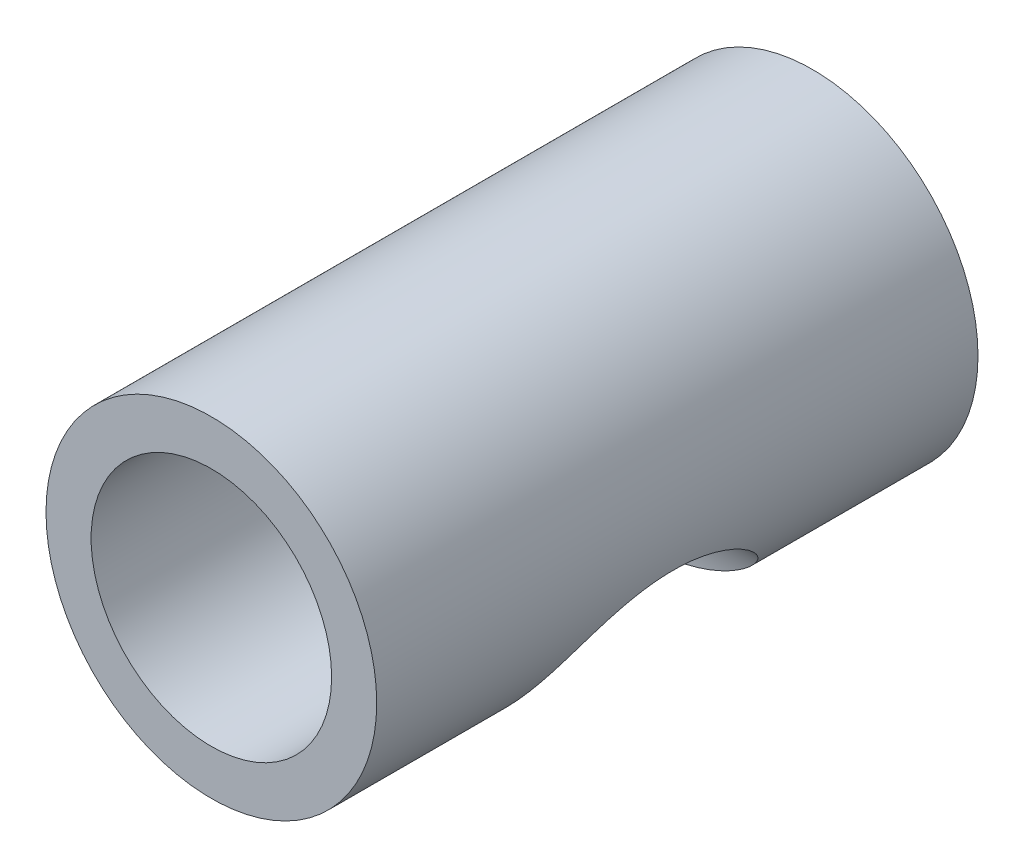
ISO-10303-21;
HEADER;
FILE_DESCRIPTION(('STEP AP214'),'2;1');
FILE_NAME('part.step','',(''),(''),'','','');
FILE_SCHEMA(('AUTOMOTIVE_DESIGN { 1 0 10303 214 1 1 1 1 }'));
ENDSEC;
DATA;
#1=APPLICATION_CONTEXT('core data for automotive mechanical design processes');
#2=APPLICATION_PROTOCOL_DEFINITION('international standard','automotive_design',2000,#1);
#3=PRODUCT_CONTEXT('',#1,'mechanical');
#4=PRODUCT('Part','Part','',(#3));
#5=PRODUCT_RELATED_PRODUCT_CATEGORY('part','',(#4));
#6=PRODUCT_DEFINITION_FORMATION('','',#4);
#7=PRODUCT_DEFINITION_CONTEXT('part definition',#1,'design');
#8=PRODUCT_DEFINITION('design','',#6,#7);
#9=PRODUCT_DEFINITION_SHAPE('','',#8);
#10=(LENGTH_UNIT() NAMED_UNIT(*) SI_UNIT(.MILLI.,.METRE.));
#11=(NAMED_UNIT(*) PLANE_ANGLE_UNIT() SI_UNIT($,.RADIAN.));
#12=(NAMED_UNIT(*) SI_UNIT($,.STERADIAN.) SOLID_ANGLE_UNIT());
#13=UNCERTAINTY_MEASURE_WITH_UNIT(LENGTH_MEASURE(1.E-05),#10,'distance_accuracy_value','');
#14=(GEOMETRIC_REPRESENTATION_CONTEXT(3) GLOBAL_UNCERTAINTY_ASSIGNED_CONTEXT((#13)) GLOBAL_UNIT_ASSIGNED_CONTEXT((#10,
#11,#12)) REPRESENTATION_CONTEXT('',''));
#15=CARTESIAN_POINT('',(0.,0.,0.));
#16=DIRECTION('',(0.,0.,1.));
#17=DIRECTION('',(1.,0.,0.));
#18=AXIS2_PLACEMENT_3D('',#15,#16,#17);
#19=CARTESIAN_POINT('',(0.,0.,-40.));
#20=DIRECTION('',(0.,0.,1.));
#21=DIRECTION('',(1.,0.,0.));
#22=AXIS2_PLACEMENT_3D('',#19,#20,#21);
#23=CYLINDRICAL_SURFACE('',#22,22.);
#24=CARTESIAN_POINT('',(0.,-22.,-17.9722007556114));
#25=CARTESIAN_POINT('',(0.609955336129801,-21.9999959282039,-17.9722080575245));
#26=CARTESIAN_POINT('',(1.22003626195506,-21.9746113319109,-17.9708440628016));
#27=CARTESIAN_POINT('',(2.43607714416588,-21.8732259564118,-17.9647677399582));
#28=CARTESIAN_POINT('',(3.04203582922194,-21.7972102188333,-17.9600544222921));
#29=CARTESIAN_POINT('',(4.24655181825611,-21.5949145393605,-17.9453628122306));
#30=CARTESIAN_POINT('',(4.84509438034091,-21.4685472160377,-17.9353753571082));
#31=CARTESIAN_POINT('',(6.0293584937757,-21.1664885490568,-17.907015965231));
#32=CARTESIAN_POINT('',(6.61508107242791,-20.9908011732707,-17.8886447028916));
#33=CARTESIAN_POINT('',(7.77105596415011,-20.5909143267139,-17.8391982534825));
#34=CARTESIAN_POINT('',(8.34126013954119,-20.3665798195735,-17.8080874857045));
#35=CARTESIAN_POINT('',(9.46003109063052,-19.8716362259652,-17.7278358265739));
#36=CARTESIAN_POINT('',(10.0085957219693,-19.6010225675942,-17.6786931533048));
#37=CARTESIAN_POINT('',(11.0784332175156,-19.0168128392235,-17.5562844432369));
#38=CARTESIAN_POINT('',(11.5997485168614,-18.7032865303422,-17.4830572937982));
#39=CARTESIAN_POINT('',(12.6109774932668,-18.0368923793146,-17.3056723965195));
#40=CARTESIAN_POINT('',(13.1009019694077,-17.6840381824503,-17.2015253559695));
#41=CARTESIAN_POINT('',(13.9282071127263,-17.0355360560999,-16.9856245811256));
#42=CARTESIAN_POINT('',(14.2734640922341,-16.7471702811829,-16.8820454504192));
#43=CARTESIAN_POINT('',(14.9411590455238,-16.1542855371132,-16.6504483479208));
#44=CARTESIAN_POINT('',(15.2636005873643,-15.8497691068178,-16.5224342090987));
#45=CARTESIAN_POINT('',(15.8834686268366,-15.2285204127579,-16.2394728854114));
#46=CARTESIAN_POINT('',(16.1809142545,-14.911797766582,-16.0845465808682));
#47=CARTESIAN_POINT('',(16.7494149567952,-14.2702758067395,-15.7455861667878));
#48=CARTESIAN_POINT('',(17.0204695237202,-13.9454763378431,-15.5615514974475));
#49=CARTESIAN_POINT('',(17.5361932203897,-13.2912096543011,-15.1620233304702));
#50=CARTESIAN_POINT('',(17.7807333508621,-12.9617277322753,-14.9463870695897));
#51=CARTESIAN_POINT('',(18.2414100978174,-12.3049535175245,-14.483690973434));
#52=CARTESIAN_POINT('',(18.4575466256891,-11.9776612316336,-14.2366310401307));
#53=CARTESIAN_POINT('',(18.8616232900406,-11.3306968575457,-13.7113454052296));
#54=CARTESIAN_POINT('',(19.0495602768088,-11.0110256239215,-13.4331162282758));
#55=CARTESIAN_POINT('',(19.3981467114198,-10.3846241064263,-12.8466468569749));
#56=CARTESIAN_POINT('',(19.5587972609645,-10.0778933004558,-12.5384078750778));
#57=CARTESIAN_POINT('',(19.8432928445358,-9.50464768410305,-11.9180624315123));
#58=CARTESIAN_POINT('',(19.9689982462587,-9.23684371313795,-11.6079941981621));
#59=CARTESIAN_POINT('',(20.2001318940581,-8.71979806019983,-10.9656643305917));
#60=CARTESIAN_POINT('',(20.3055613009792,-8.47055531605743,-10.6334039683871));
#61=CARTESIAN_POINT('',(20.4980704216434,-7.99345507806047,-9.94875621981602));
#62=CARTESIAN_POINT('',(20.5851470156879,-7.7656012236365,-9.59636542450149));
#63=CARTESIAN_POINT('',(20.7429457272325,-7.33369512557773,-8.87378654804236));
#64=CARTESIAN_POINT('',(20.8136670432232,-7.1296440486685,-8.50359759575174));
#65=CARTESIAN_POINT('',(20.9435455505268,-6.73885542524165,-7.7311497409779));
#66=CARTESIAN_POINT('',(21.0020565167813,-6.55327568284667,-7.32819646064899));
#67=CARTESIAN_POINT('',(21.1055498854396,-6.21189110343821,-6.50819979190588));
#68=CARTESIAN_POINT('',(21.150532026613,-6.05608684138555,-6.09115613159114));
#69=CARTESIAN_POINT('',(21.2288590530953,-5.77553230903539,-5.24558723367132));
#70=CARTESIAN_POINT('',(21.2622012555323,-5.65078919987349,-4.81705937356551));
#71=CARTESIAN_POINT('',(21.3187974105929,-5.43336853067448,-3.95129044933738));
#72=CARTESIAN_POINT('',(21.342050981481,-5.34069218401219,-3.51404905616543));
#73=CARTESIAN_POINT('',(21.3810198924685,-5.18257980820202,-2.60173421267265));
#74=CARTESIAN_POINT('',(21.3960705824882,-5.11959055252577,-2.12620663802647));
#75=CARTESIAN_POINT('',(21.4168954563876,-5.03176103023032,-1.17142988822584));
#76=CARTESIAN_POINT('',(21.4226692102147,-5.00692253217514,-0.692180541575295));
#77=CARTESIAN_POINT('',(21.4253150564338,-4.99558936670512,0.266915425038783));
#78=CARTESIAN_POINT('',(21.4221849804319,-5.00910403962729,0.746762162042908));
#79=CARTESIAN_POINT('',(21.4068133884969,-5.07439231405331,1.70370020738862));
#80=CARTESIAN_POINT('',(21.3945718232356,-5.12616612268673,2.18079150079854));
#81=CARTESIAN_POINT('',(21.3597476825997,-5.26941793087152,3.14139991599998));
#82=CARTESIAN_POINT('',(21.3369027960953,-5.36189980069685,3.62475832141983));
#83=CARTESIAN_POINT('',(21.2793517491399,-5.58592411722927,4.58163869013182));
#84=CARTESIAN_POINT('',(21.2446452669753,-5.71746762336501,5.05516038626024));
#85=CARTESIAN_POINT('',(21.1613621467633,-6.01839771596442,5.98880067922696));
#86=CARTESIAN_POINT('',(21.1127851302238,-6.18778533507174,6.44891890994063));
#87=CARTESIAN_POINT('',(20.9992745658811,-6.56268242742935,7.35211750004768));
#88=CARTESIAN_POINT('',(20.9343415315566,-6.76819076664948,7.79519839380565));
#89=CARTESIAN_POINT('',(20.7867680541933,-7.2085412818245,8.65200214963934));
#90=CARTESIAN_POINT('',(20.7045096522397,-7.44271102641215,9.06613603570466));
#91=CARTESIAN_POINT('',(20.5186826699147,-7.940670096908,9.87119874406365));
#92=CARTESIAN_POINT('',(20.415114315878,-8.2044591082141,10.2621278127607));
#93=CARTESIAN_POINT('',(20.1839043052163,-8.75784283271679,11.0172540294381));
#94=CARTESIAN_POINT('',(20.0562816242776,-9.04741711038917,11.3814719365104));
#95=CARTESIAN_POINT('',(19.774307334063,-9.64814876234667,12.0805799132588));
#96=CARTESIAN_POINT('',(19.619957986526,-9.95930430898663,12.4154724609796));
#97=CARTESIAN_POINT('',(19.2946654912596,-10.5748810421181,13.0304180510124));
#98=CARTESIAN_POINT('',(19.1257356604049,-10.8781559750019,13.3126865119064));
#99=CARTESIAN_POINT('',(18.7619335441578,-11.4942494000852,13.8486236966863));
#100=CARTESIAN_POINT('',(18.567062731025,-11.8070673499023,14.1022940421274));
#101=CARTESIAN_POINT('',(18.1509011515997,-12.4373367122326,14.5803495839554));
#102=CARTESIAN_POINT('',(17.9296153004261,-12.7547872531277,14.8047402122858));
#103=CARTESIAN_POINT('',(17.4607388470115,-13.3894823547935,15.2244118006337));
#104=CARTESIAN_POINT('',(17.2131483197426,-13.7067269161487,15.419692843614));
#105=CARTESIAN_POINT('',(16.7033472508835,-14.3231075128395,15.774431219362));
#106=CARTESIAN_POINT('',(16.442183143534,-14.6224455333049,15.9350462786833));
#107=CARTESIAN_POINT('',(15.8975362001863,-15.2128113412458,16.2317235264531));
#108=CARTESIAN_POINT('',(15.6140541400891,-15.503839417144,16.3677865679307));
#109=CARTESIAN_POINT('',(15.0261026558583,-16.0743301235777,16.617222242592));
#110=CARTESIAN_POINT('',(14.7216270150908,-16.3537892887726,16.7305881155428));
#111=CARTESIAN_POINT('',(14.0933763925753,-16.8982118332868,16.9367332007778));
#112=CARTESIAN_POINT('',(13.7696002262776,-17.1631743209698,17.0295111478458));
#113=CARTESIAN_POINT('',(13.0730150021984,-17.7004970145284,17.2047237514287));
#114=CARTESIAN_POINT('',(12.6984643037641,-17.9711881407467,17.2853511417694));
#115=CARTESIAN_POINT('',(11.9305922826194,-18.4898811204661,17.4278855320789));
#116=CARTESIAN_POINT('',(11.5372700406044,-18.7378818610054,17.4897916141119));
#117=CARTESIAN_POINT('',(10.7339076701721,-19.2093794819341,17.598003987053));
#118=CARTESIAN_POINT('',(10.3238596079808,-19.4328645436189,17.6443027759803));
#119=CARTESIAN_POINT('',(9.48938283393815,-19.8537161671667,17.7241860445349));
#120=CARTESIAN_POINT('',(9.06495322604144,-20.0510810978367,17.7577697303521));
#121=CARTESIAN_POINT('',(8.12901944525285,-20.4504483444325,17.8198620978762));
#122=CARTESIAN_POINT('',(7.61518880697327,-20.647309150528,17.8464780204154));
#123=CARTESIAN_POINT('',(6.57383034419131,-21.0020814277692,17.8896689133302));
#124=CARTESIAN_POINT('',(6.04630123166642,-21.1599892215271,17.9062429359077));
#125=CARTESIAN_POINT('',(4.98055541747345,-21.4358841990255,17.9324501519492));
#126=CARTESIAN_POINT('',(4.44233530507034,-21.5538584190138,17.9420810926044));
#127=CARTESIAN_POINT('',(3.35850477632841,-21.749107923107,17.9567491034816));
#128=CARTESIAN_POINT('',(2.81289415247145,-21.8263820619545,17.9617860444362));
#129=CARTESIAN_POINT('',(1.66034296633937,-21.9456800568775,17.9692081879324));
#130=CARTESIAN_POINT('',(1.05292896344783,-21.9831985968369,17.9712628785934));
#131=CARTESIAN_POINT('',(-0.162952281102827,-22.0077998177511,17.9726366404779));
#132=CARTESIAN_POINT('',(-0.771419598516798,-21.9948787064378,17.9719555060101));
#133=CARTESIAN_POINT('',(-1.98550568695384,-21.9186654804486,17.9675311656583));
#134=CARTESIAN_POINT('',(-2.59112280491597,-21.8553470709737,17.9637863612755));
#135=CARTESIAN_POINT('',(-3.79497423731832,-21.6787518006826,17.9516606167276));
#136=CARTESIAN_POINT('',(-4.39320866445242,-21.5654757034232,17.9432797474198));
#137=CARTESIAN_POINT('',(-5.58712383561355,-21.2876811007909,17.9189201620001));
#138=CARTESIAN_POINT('',(-6.18262737831102,-21.1224094921258,17.9028278350189));
#139=CARTESIAN_POINT('',(-7.35731049564541,-20.742493259049,17.8588971057447));
#140=CARTESIAN_POINT('',(-7.93648872521252,-20.5278445796482,17.8310577385938));
#141=CARTESIAN_POINT('',(-9.07348249771636,-20.0512248921329,17.7584563388569));
#142=CARTESIAN_POINT('',(-9.63131311777539,-19.7892880586307,17.71370650191));
#143=CARTESIAN_POINT('',(-10.7212010988965,-19.2206486907891,17.6011489536339));
#144=CARTESIAN_POINT('',(-11.2532649001292,-18.9139574201086,17.5333470382874));
#145=CARTESIAN_POINT('',(-12.1789421199561,-18.3277908798878,17.3851010975318));
#146=CARTESIAN_POINT('',(-12.5783066212634,-18.0559565008109,17.3102334891767));
#147=CARTESIAN_POINT('',(-13.3552085463248,-17.4891246087697,17.1382014680578));
#148=CARTESIAN_POINT('',(-13.7327488667066,-17.1941301820499,17.0410400228032));
#149=CARTESIAN_POINT('',(-14.4631402527292,-16.5844404945026,16.8209839190955));
#150=CARTESIAN_POINT('',(-14.8160119817833,-16.2697621507838,16.6981111505707));
#151=CARTESIAN_POINT('',(-15.4949713329612,-15.624505210186,16.4233064934063));
#152=CARTESIAN_POINT('',(-15.8210586530568,-15.2939264340761,16.2713742771488));
#153=CARTESIAN_POINT('',(-16.4464913591613,-14.6193687103787,15.9344937142741));
#154=CARTESIAN_POINT('',(-16.7456312357255,-14.2753115073112,15.7493193956491));
#155=CARTESIAN_POINT('',(-17.3128815600375,-13.5817828521157,15.3446506781699));
#156=CARTESIAN_POINT('',(-17.5809919949813,-13.2323113977536,15.1251562651541));
#157=CARTESIAN_POINT('',(-18.0851955864276,-12.5343931528776,14.6509038385388));
#158=CARTESIAN_POINT('',(-18.3212989325634,-12.1859460709727,14.3961571001491));
#159=CARTESIAN_POINT('',(-18.7615929844714,-11.4965184782642,13.8514553909576));
#160=CARTESIAN_POINT('',(-18.9657867413567,-11.1555372562782,13.5615037910713));
#161=CARTESIAN_POINT('',(-19.3212641680024,-10.5263376350481,12.9833931990099));
#162=CARTESIAN_POINT('',(-19.4759403419711,-10.2365994887254,12.6989587886746));
#163=CARTESIAN_POINT('',(-19.7624241761547,-9.67196022687255,12.1050075048996));
#164=CARTESIAN_POINT('',(-19.8942338180852,-9.39705782703436,11.7954928084435));
#165=CARTESIAN_POINT('',(-20.1366793406602,-8.86563616089515,11.1531859162055));
#166=CARTESIAN_POINT('',(-20.2473113729309,-8.60912024105451,10.8203895046686));
#167=CARTESIAN_POINT('',(-20.449330517917,-8.11760504590501,10.1337362842141));
#168=CARTESIAN_POINT('',(-20.5407168545145,-7.88260663854525,9.77987862670108));
#169=CARTESIAN_POINT('',(-20.7070031053443,-7.4348867048159,9.0505169496052));
#170=CARTESIAN_POINT('',(-20.7817624605859,-7.22236252508733,8.67485990629495));
#171=CARTESIAN_POINT('',(-20.9159781220775,-6.82393343884376,7.90708202989412));
#172=CARTESIAN_POINT('',(-20.9754345201487,-6.63802837261133,7.51496129560564));
#173=CARTESIAN_POINT('',(-21.0810785920763,-6.29447737256152,6.71672250207068));
#174=CARTESIAN_POINT('',(-21.1272637028386,-6.13683689971489,6.31060175593026));
#175=CARTESIAN_POINT('',(-21.2081621397067,-5.85114536301618,5.48696788542021));
#176=CARTESIAN_POINT('',(-21.242874924246,-5.72309569612368,5.06945422423959));
#177=CARTESIAN_POINT('',(-21.304646074299,-5.48888645527776,4.19310146813683));
#178=CARTESIAN_POINT('',(-21.3309108797715,-5.38516636863692,3.73355285697391));
#179=CARTESIAN_POINT('',(-21.3733887419386,-5.21402198815889,2.80728309917185));
#180=CARTESIAN_POINT('',(-21.3896013411431,-5.146599346288,2.34056162707618));
#181=CARTESIAN_POINT('',(-21.4129527367268,-5.04856442950113,1.4029264479796));
#182=CARTESIAN_POINT('',(-21.4200892836453,-5.01796128024076,0.93201173081188));
#183=CARTESIAN_POINT('',(-21.4257284951677,-4.99382671515735,-0.0108186390966603));
#184=CARTESIAN_POINT('',(-21.424231037396,-5.00029582478393,-0.482734305929829));
#185=CARTESIAN_POINT('',(-21.4122703991247,-5.05127856801201,-1.44367761751954));
#186=CARTESIAN_POINT('',(-21.4014447998931,-5.09732987371577,-1.93262000982575));
#187=CARTESIAN_POINT('',(-21.3696156643365,-5.22915969278198,-2.90480217056602));
#188=CARTESIAN_POINT('',(-21.3486117768064,-5.31493957698758,-3.38804174163294));
#189=CARTESIAN_POINT('',(-21.2950823297299,-5.52551027316797,-4.34539431791827));
#190=CARTESIAN_POINT('',(-21.2625547905062,-5.65030778764733,-4.81950574022437));
#191=CARTESIAN_POINT('',(-21.1840758099042,-5.93777016673801,-5.75497396930827));
#192=CARTESIAN_POINT('',(-21.1381245985726,-6.10043438240313,-6.21633099451489));
#193=CARTESIAN_POINT('',(-21.0307223229794,-6.46094893478917,-7.12004493201384));
#194=CARTESIAN_POINT('',(-20.9693644187666,-6.65858575348613,-7.56249797920894));
#195=CARTESIAN_POINT('',(-20.8282899385643,-7.0875442558355,-8.42774500282049));
#196=CARTESIAN_POINT('',(-20.74857329096,-7.31886607088695,-8.85053890254167));
#197=CARTESIAN_POINT('',(-20.5678888588997,-7.81222627212587,-9.67270433869844));
#198=CARTESIAN_POINT('',(-20.4669340584733,-8.0742458479467,-10.0720899959831));
#199=CARTESIAN_POINT('',(-20.240777328679,-8.62552162569339,-10.8443239870833));
#200=CARTESIAN_POINT('',(-20.1155772621138,-8.91477573426981,-11.2171743566398));
#201=CARTESIAN_POINT('',(-19.8464471712965,-9.49818158815046,-11.9119381670467));
#202=CARTESIAN_POINT('',(-19.7040765473281,-9.79101587113957,-12.2355627081174));
#203=CARTESIAN_POINT('',(-19.3935527929566,-10.3925264343281,-12.8544853610104));
#204=CARTESIAN_POINT('',(-19.2254009027734,-10.7012019520025,-13.149784834313));
#205=CARTESIAN_POINT('',(-18.8620412865074,-11.3293846844285,-13.7103570682231));
#206=CARTESIAN_POINT('',(-18.666846371258,-11.6488867166178,-13.9756439389492));
#207=CARTESIAN_POINT('',(-18.2486641158129,-12.293650440332,-14.4755130312534));
#208=CARTESIAN_POINT('',(-18.0256777776373,-12.6189119238371,-14.7100963592234));
#209=CARTESIAN_POINT('',(-17.5675371124705,-13.2485144475013,-15.1341682902573));
#210=CARTESIAN_POINT('',(-17.334141911255,-13.5528274605831,-15.3256060650333));
#211=CARTESIAN_POINT('',(-16.8437496807457,-14.1576710251922,-15.6823628199033));
#212=CARTESIAN_POINT('',(-16.5867538439595,-14.4582017669611,-15.8476831185305));
#213=CARTESIAN_POINT('',(-16.0501419477171,-15.0516784952989,-16.1535035946759));
#214=CARTESIAN_POINT('',(-15.7705214392154,-15.3446229750378,-16.2939988730812));
#215=CARTESIAN_POINT('',(-15.1900722915367,-15.9194400341549,-16.551886120559));
#216=CARTESIAN_POINT('',(-14.8892425680468,-16.2013120463086,-16.6692769072584));
#217=CARTESIAN_POINT('',(-14.2517486571284,-16.7653847574694,-16.8886319560421));
#218=CARTESIAN_POINT('',(-13.9140335543238,-17.0468341023303,-16.9894706491745));
#219=CARTESIAN_POINT('',(-13.2188920979495,-17.5913579052044,-17.1705837880585));
#220=CARTESIAN_POINT('',(-12.861465186227,-17.8544318424272,-17.2508576511398));
#221=CARTESIAN_POINT('',(-12.1286910428689,-18.3600968959772,-17.3936881279823));
#222=CARTESIAN_POINT('',(-11.7533321295101,-18.6026743671007,-17.4562330031696));
#223=CARTESIAN_POINT('',(-10.9869146495273,-19.0653648230951,-17.566308724486));
#224=CARTESIAN_POINT('',(-10.5958552759009,-19.2854766511687,-17.6138387977391));
#225=CARTESIAN_POINT('',(-9.73392526474554,-19.7363833527559,-17.7033923863781));
#226=CARTESIAN_POINT('',(-9.26057700184831,-19.962892434409,-17.7431941981762));
#227=CARTESIAN_POINT('',(-8.29809438278016,-20.3817857676804,-17.809827267962));
#228=CARTESIAN_POINT('',(-7.80895772873389,-20.5741650252629,-17.8366566287491));
#229=CARTESIAN_POINT('',(-6.81807418083182,-20.9234245140722,-17.8806822985942));
#230=CARTESIAN_POINT('',(-6.31633437928659,-21.0803242349572,-17.8978839040798));
#231=CARTESIAN_POINT('',(-5.30280764204462,-21.3578135506762,-17.925476317346));
#232=CARTESIAN_POINT('',(-4.79102260130872,-21.4784099250634,-17.9358683972145));
#233=CARTESIAN_POINT('',(-3.92389017418285,-21.6502126684017,-17.9494534681948));
#234=CARTESIAN_POINT('',(-3.57048333935236,-21.7112927108781,-17.9538846486696));
#235=CARTESIAN_POINT('',(-2.86104933473744,-21.8161169003032,-17.9611024287666));
#236=CARTESIAN_POINT('',(-2.50502196171638,-21.8598596879138,-17.9638888994426));
#237=CARTESIAN_POINT('',(-1.7912450099034,-21.9298889995194,-17.96819688938));
#238=CARTESIAN_POINT('',(-1.43349542977819,-21.9561755099977,-17.969718407662));
#239=CARTESIAN_POINT('',(-0.717178339268484,-21.9912317210906,-17.9717181653195));
#240=CARTESIAN_POINT('',(-0.358610875387091,-22.00000239393,-17.9721964625997));
#241=CARTESIAN_POINT('',(0.,-22.,-17.9722007556114));
#242=B_SPLINE_CURVE_WITH_KNOTS('',3,(#24,#25,#26,#27,#28,#29,#30,#31,#32,#33,#34,#35,#36,#37,
#38,#39,#40,#41,#42,#43,#44,#45,#46,#47,#48,#49,#50,#51,#52,#53,#54,#55,#56,#57,#58,#59,#60,#61,
#62,#63,#64,#65,#66,#67,#68,#69,#70,#71,#72,#73,#74,#75,#76,#77,#78,#79,#80,#81,#82,#83,#84,#85,
#86,#87,#88,#89,#90,#91,#92,#93,#94,#95,#96,#97,#98,#99,#100,#101,#102,#103,#104,#105,#106,#107,
#108,#109,#110,#111,#112,#113,#114,#115,#116,#117,#118,#119,#120,#121,#122,#123,#124,#125,#126,
#127,#128,#129,#130,#131,#132,#133,#134,#135,#136,#137,#138,#139,#140,#141,#142,#143,#144,#145,
#146,#147,#148,#149,#150,#151,#152,#153,#154,#155,#156,#157,#158,#159,#160,#161,#162,#163,#164,
#165,#166,#167,#168,#169,#170,#171,#172,#173,#174,#175,#176,#177,#178,#179,#180,#181,#182,#183,
#184,#185,#186,#187,#188,#189,#190,#191,#192,#193,#194,#195,#196,#197,#198,#199,#200,#201,#202,
#203,#204,#205,#206,#207,#208,#209,#210,#211,#212,#213,#214,#215,#216,#217,#218,#219,#220,#221,
#222,#223,#224,#225,#226,#227,#228,#229,#230,#231,#232,#233,#234,#235,#236,#237,#238,#239,#240,
#241),.UNSPECIFIED.,.T.,.F.,(4,2,2,2,2,2,2,2,2,2,2,2,2,2,2,2,2,2,2,2,2,2,2,2,2,2,2,2,2,2,2,2,2,
2,2,2,2,2,2,2,2,2,2,2,2,2,2,2,2,2,2,2,2,2,2,2,2,2,2,2,2,2,2,2,2,2,2,2,2,2,2,2,2,2,2,2,2,2,2,2,2,
2,2,2,2,2,2,2,2,2,2,2,2,2,2,2,2,2,2,2,2,2,2,2,2,2,2,2,4),(0.,1.82955442278934,3.65964960571486,
5.49293471262732,7.32607237126076,9.16436518247888,11.0028397030961,12.8383602338216,
14.6732458796494,16.0567248804553,17.4399870414776,18.8221807267675,20.2044009972189,
21.593069920728,22.9817431763884,24.3705714228579,25.7593435814397,27.043561514933,
28.327705902274,29.6120683988725,30.8964938238189,32.2374691370058,33.5784703416435,
34.9197804278765,36.2611412624183,37.699246484283,39.1374183707322,40.5759405323326,
42.014470481946,43.4906572543379,44.9668840674845,46.4431511670145,47.9193719265914,
49.3659287448476,50.8124701999024,52.2578752650748,53.7031580728552,55.0436961652896,
56.3841582089726,57.7243712168534,59.0645804050369,60.3486657830503,61.6327065385425,
62.9171291717666,64.2016307164093,65.6075773132199,67.0135928346816,68.4202832272446,
69.8270614257093,71.4780250691212,73.129144513374,74.7807994524301,76.4325008648355,
78.2560915166682,80.0798192764632,81.9044991907725,83.729151217518,85.5815528429957,
87.4341066474408,89.2853269530047,91.1360821501286,92.6012700163031,94.0662629658815,
95.5300136979178,96.9937809333347,98.4679037503848,99.9420271757141,101.415680198064,
102.889192227158,104.191082119334,105.492859127499,106.794872469166,108.09693830686,
109.409625001654,110.722303819862,112.035235986631,113.348230123279,114.76215888094,
116.17615198377,117.590495470507,119.004859003718,120.476786227665,121.948764244562,
123.420995259017,124.893201044751,126.356710597339,127.820225858964,129.28284898138,
130.745359772672,132.120776024195,133.49612613142,134.870826920907,136.245478159866,
137.529908639309,138.814274253915,140.098893050259,141.383577569934,142.735342726929,
144.087146179716,145.43984259809,146.792608634188,148.36979883938,149.947219636438,
151.523771806551,153.100029376845,154.175653370759,155.251361682952,156.327070828077,
157.402720263801),.UNSPECIFIED.);
#243=CARTESIAN_POINT('',(0.,-22.,-17.9722007556114));
#244=VERTEX_POINT('',#243);
#245=EDGE_CURVE('E58',#244,#244,#242,.T.);
#246=ORIENTED_EDGE('',*,*,#245,.F.);
#247=EDGE_LOOP('',(#246));
#248=FACE_BOUND('',#247,.T.);
#249=CARTESIAN_POINT('',(0.,0.,-40.));
#250=DIRECTION('',(0.,0.,1.));
#251=DIRECTION('',(1.,0.,0.));
#252=AXIS2_PLACEMENT_3D('',#249,#250,#251);
#253=CIRCLE('',#252,22.);
#254=CARTESIAN_POINT('',(22.,0.,-40.));
#255=VERTEX_POINT('',#254);
#256=EDGE_CURVE('E10',#255,#255,#253,.T.);
#257=ORIENTED_EDGE('',*,*,#256,.T.);
#258=EDGE_LOOP('',(#257));
#259=FACE_BOUND('',#258,.T.);
#260=CARTESIAN_POINT('',(0.,0.,40.));
#261=DIRECTION('',(0.,0.,1.));
#262=DIRECTION('',(1.,0.,0.));
#263=AXIS2_PLACEMENT_3D('',#260,#261,#262);
#264=CIRCLE('',#263,22.);
#265=CARTESIAN_POINT('',(22.,0.,40.));
#266=VERTEX_POINT('',#265);
#267=EDGE_CURVE('E50',#266,#266,#264,.T.);
#268=ORIENTED_EDGE('',*,*,#267,.F.);
#269=EDGE_LOOP('',(#268));
#270=FACE_BOUND('',#269,.T.);
#271=ADVANCED_FACE('F33',(#248,#259,#270),#23,.T.);
#272=CARTESIAN_POINT('',(0.,0.,-40.));
#273=DIRECTION('',(0.,0.,1.));
#274=DIRECTION('',(1.,0.,0.));
#275=AXIS2_PLACEMENT_3D('',#272,#273,#274);
#276=PLANE('',#275);
#277=CARTESIAN_POINT('',(0.,0.,-40.));
#278=DIRECTION('',(0.,0.,1.));
#279=DIRECTION('',(1.,0.,0.));
#280=AXIS2_PLACEMENT_3D('',#277,#278,#279);
#281=CIRCLE('',#280,16.);
#282=CARTESIAN_POINT('',(16.,0.,-40.));
#283=VERTEX_POINT('',#282);
#284=EDGE_CURVE('E46',#283,#283,#281,.T.);
#285=ORIENTED_EDGE('',*,*,#284,.T.);
#286=EDGE_LOOP('',(#285));
#287=FACE_BOUND('',#286,.T.);
#288=ORIENTED_EDGE('',*,*,#256,.F.);
#289=EDGE_LOOP('',(#288));
#290=FACE_BOUND('',#289,.T.);
#291=ADVANCED_FACE('F75',(#287,#290),#276,.F.);
#292=CARTESIAN_POINT('',(0.,0.,-40.));
#293=DIRECTION('',(0.,0.,1.));
#294=DIRECTION('',(1.,0.,0.));
#295=AXIS2_PLACEMENT_3D('',#292,#293,#294);
#296=CYLINDRICAL_SURFACE('',#295,16.);
#297=CARTESIAN_POINT('',(0.,-16.,-16.583123951777));
#298=CARTESIAN_POINT('',(0.402852087683734,-15.9999994695357,-16.5831243434702));
#299=CARTESIAN_POINT('',(0.805713046698957,-15.9847724622774,-16.5767210143745));
#300=CARTESIAN_POINT('',(1.60873455012412,-15.9240106985183,-16.5508748535843));
#301=CARTESIAN_POINT('',(2.00889500241316,-15.8784749133373,-16.5314315793137));
#302=CARTESIAN_POINT('',(2.80383960119146,-15.7575423084469,-16.4788092374949));
#303=CARTESIAN_POINT('',(3.19862285819317,-15.6821406089528,-16.4456279252518));
#304=CARTESIAN_POINT('',(3.97996234194211,-15.5022772070773,-16.3644090230876));
#305=CARTESIAN_POINT('',(4.36651865571733,-15.3978158122662,-16.3163715904044));
#306=CARTESIAN_POINT('',(5.12944418607889,-15.1607622052794,-16.2038142517075));
#307=CARTESIAN_POINT('',(5.50578827562522,-15.0281066502426,-16.1392571637886));
#308=CARTESIAN_POINT('',(6.24447847558824,-14.7364902943711,-15.9919066438675));
#309=CARTESIAN_POINT('',(6.60682451351397,-14.5775293573327,-15.9091131174402));
#310=CARTESIAN_POINT('',(7.31443580325185,-14.2356362314248,-15.723350001212));
#311=CARTESIAN_POINT('',(7.65970937288672,-14.0527158774678,-15.6203903602401));
#312=CARTESIAN_POINT('',(8.33052013388151,-13.6657357445919,-15.392268167129));
#313=CARTESIAN_POINT('',(8.65605840205211,-13.461677120682,-15.2671068278393));
#314=CARTESIAN_POINT('',(9.27249810653631,-13.0443048340021,-14.998110187173));
#315=CARTESIAN_POINT('',(9.56425541365506,-12.8316629761601,-14.8551940888607));
#316=CARTESIAN_POINT('',(10.1250949581051,-12.3939090082524,-14.5458797120833));
#317=CARTESIAN_POINT('',(10.394177919647,-12.1687972968503,-14.3794821840611));
#318=CARTESIAN_POINT('',(10.9079980502912,-11.7104258679033,-14.0224760627059));
#319=CARTESIAN_POINT('',(11.152745959753,-11.4771698068665,-13.8318782355941));
#320=CARTESIAN_POINT('',(11.6170738749798,-11.006942466241,-13.4262035832993));
#321=CARTESIAN_POINT('',(11.8366548538041,-10.7699713306957,-13.2111277051818));
#322=CARTESIAN_POINT('',(12.2374037050752,-10.311776381008,-12.7711956008929));
#323=CARTESIAN_POINT('',(12.4201175383043,-10.0904977073675,-12.5478004819718));
#324=CARTESIAN_POINT('',(12.7635741907138,-9.65239141520425,-12.0807221772243));
#325=CARTESIAN_POINT('',(12.9243180343244,-9.43556358954563,-11.8370399382114));
#326=CARTESIAN_POINT('',(13.2247263885157,-9.00969259711474,-11.3305256091217));
#327=CARTESIAN_POINT('',(13.3643854405472,-8.80065145671806,-11.0676885861702));
#328=CARTESIAN_POINT('',(13.623832690704,-8.39341967583979,-10.5244039962055));
#329=CARTESIAN_POINT('',(13.7436199429506,-8.19522955215692,-10.2439555917828));
#330=CARTESIAN_POINT('',(13.9694632680878,-7.80430499207865,-9.65509664783993));
#331=CARTESIAN_POINT('',(14.0747388570243,-7.61214231512275,-9.34600783400092));
#332=CARTESIAN_POINT('',(14.2672942118242,-7.2448143561997,-8.71253175892136));
#333=CARTESIAN_POINT('',(14.3545736451225,-7.06964938837838,-8.38814421509953));
#334=CARTESIAN_POINT('',(14.5131211282544,-6.73818166812483,-7.72595702376875));
#335=CARTESIAN_POINT('',(14.5843833153166,-6.58188583199374,-7.38815251833046));
#336=CARTESIAN_POINT('',(14.7127412999132,-6.28972981174363,-6.70121048885248));
#337=CARTESIAN_POINT('',(14.769836246362,-6.1538708555468,-6.35207228537402));
#338=CARTESIAN_POINT('',(14.8782416460693,-5.88738321888548,-5.598073165612));
#339=CARTESIAN_POINT('',(14.9278187269313,-5.75976290988199,-5.19189690174402));
#340=CARTESIAN_POINT('',(15.0132108608752,-5.53336540895186,-4.37016658447038));
#341=CARTESIAN_POINT('',(15.0490249117276,-5.43459031767169,-3.95461185045258));
#342=CARTESIAN_POINT('',(15.1086003398458,-5.26670115852771,-3.11653915898921));
#343=CARTESIAN_POINT('',(15.1323570353836,-5.19759861376241,-2.69401856242773));
#344=CARTESIAN_POINT('',(15.1690033827639,-5.08965353678537,-1.84466418078642));
#345=CARTESIAN_POINT('',(15.1818926501803,-5.0508120750374,-1.41783024366629));
#346=CARTESIAN_POINT('',(15.1982569690711,-5.00137796565699,-0.520393307788512));
#347=CARTESIAN_POINT('',(15.2006871531424,-4.99392218725959,-0.0495952014382476));
#348=CARTESIAN_POINT('',(15.1934436704775,-5.01591354943034,0.89106790076885));
#349=CARTESIAN_POINT('',(15.1837691656826,-5.04536324512072,1.36093282976196));
#350=CARTESIAN_POINT('',(15.1516795821029,-5.1409289789348,2.29670785362722));
#351=CARTESIAN_POINT('',(15.1292587092343,-5.20706169163137,2.76261605207701));
#352=CARTESIAN_POINT('',(15.0702734937474,-5.37538862581941,3.68697110404551));
#353=CARTESIAN_POINT('',(15.0337092583077,-5.47758257403833,4.14541801407842));
#354=CARTESIAN_POINT('',(14.9435753064514,-5.71895325569608,5.05887115069006));
#355=CARTESIAN_POINT('',(14.8897379588924,-5.85870598977042,5.51369930729714));
#356=CARTESIAN_POINT('',(14.7623106823906,-6.17275324741627,6.40847492576559));
#357=CARTESIAN_POINT('',(14.6887200527457,-6.34704899626412,6.84842185912641));
#358=CARTESIAN_POINT('',(14.5183206948361,-6.72768889054809,7.70929481934766));
#359=CARTESIAN_POINT('',(14.4215253313296,-6.93401456434025,8.13023162984272));
#360=CARTESIAN_POINT('',(14.2008253910271,-7.37545919220602,8.94930426659537));
#361=CARTESIAN_POINT('',(14.0769240587847,-7.61057469868753,9.34744281458858));
#362=CARTESIAN_POINT('',(13.808360320944,-8.08692064895453,10.0885890710958));
#363=CARTESIAN_POINT('',(13.665894846282,-8.32642977394426,10.4334979082415));
#364=CARTESIAN_POINT('',(13.3515009476279,-8.82175743497559,11.0972451972582));
#365=CARTESIAN_POINT('',(13.1795740132404,-9.0775751460262,11.4160849660075));
#366=CARTESIAN_POINT('',(12.8042700181987,-9.59967972822222,12.0246402570696));
#367=CARTESIAN_POINT('',(12.6009322477252,-9.86595321462555,12.3143914277937));
#368=CARTESIAN_POINT('',(12.1613715894083,-10.4029468249809,12.8631877823824));
#369=CARTESIAN_POINT('',(11.9251537552135,-10.6736662599638,13.1222376737107));
#370=CARTESIAN_POINT('',(11.4548434219095,-11.1753233172787,13.5747882611737));
#371=CARTESIAN_POINT('',(11.2250094940886,-11.4065656055752,13.772396201518));
#372=CARTESIAN_POINT('',(10.7415158573752,-11.8629802429389,14.1440228753958));
#373=CARTESIAN_POINT('',(10.487858574693,-12.0881532071167,14.3180440066488));
#374=CARTESIAN_POINT('',(9.95789873203571,-12.5283251795242,14.6430506451255));
#375=CARTESIAN_POINT('',(9.68159242502857,-12.7433224949863,14.7940323288546));
#376=CARTESIAN_POINT('',(9.10809052715498,-13.1593378810868,15.0739595699994));
#377=CARTESIAN_POINT('',(8.81089466854636,-13.3603557724846,15.2029048449008));
#378=CARTESIAN_POINT('',(8.2112163864697,-13.736654873006,15.43493271073));
#379=CARTESIAN_POINT('',(7.90954222629786,-13.9126793979907,15.5389037524577));
#380=CARTESIAN_POINT('',(7.2910408924732,-14.2465512883999,15.7294020907126));
#381=CARTESIAN_POINT('',(6.97421435449156,-14.4043994154138,15.8159301182147));
#382=CARTESIAN_POINT('',(6.32745164715952,-14.6999934074431,15.9730374353435));
#383=CARTESIAN_POINT('',(5.99751342508541,-14.8377361089175,16.0436142160355));
#384=CARTESIAN_POINT('',(5.3266936625617,-15.091552787387,16.1702375347925));
#385=CARTESIAN_POINT('',(4.9858115434315,-15.2076256163249,16.2262833030742));
#386=CARTESIAN_POINT('',(4.27278487249813,-15.4237135667683,16.3283526882055));
#387=CARTESIAN_POINT('',(3.90004801921034,-15.5221956528282,16.3734886960226));
#388=CARTESIAN_POINT('',(3.14709475536102,-15.6921885108323,16.4500632803019));
#389=CARTESIAN_POINT('',(2.76687808309,-15.7636983372786,16.4815013765972));
#390=CARTESIAN_POINT('',(2.00133202845029,-15.879060271211,16.5316720506557));
#391=CARTESIAN_POINT('',(1.61600117770454,-15.9229042518841,16.5504008952113));
#392=CARTESIAN_POINT('',(0.842775623267288,-15.9824936714117,16.5757548174437));
#393=CARTESIAN_POINT('',(0.45488085080657,-15.998238353495,16.5823795691328));
#394=CARTESIAN_POINT('',(-0.343244350730421,-16.0015745643888,16.5837894063103));
#395=CARTESIAN_POINT('',(-0.753484130187575,-15.9875054162129,16.5778760913665));
#396=CARTESIAN_POINT('',(-1.57127152279699,-15.9279377289913,16.5525518896336));
#397=CARTESIAN_POINT('',(-1.97881902105911,-15.8824378573096,16.5331404305344));
#398=CARTESIAN_POINT('',(-2.78840823062375,-15.7604688416357,16.4800973996795));
#399=CARTESIAN_POINT('',(-3.19044884169659,-15.6839935997019,16.446463027884));
#400=CARTESIAN_POINT('',(-3.98600300164988,-15.5009152335875,16.363795638022));
#401=CARTESIAN_POINT('',(-4.37951666570433,-15.3943125166142,16.314762828082));
#402=CARTESIAN_POINT('',(-5.15599070014737,-15.1519491235486,16.1995720223208));
#403=CARTESIAN_POINT('',(-5.53892268657442,-15.0161172689258,16.1333721392114));
#404=CARTESIAN_POINT('',(-6.29016411639022,-14.7172428743168,15.9819891039092));
#405=CARTESIAN_POINT('',(-6.65847342429405,-14.5542000822833,15.8968057758755));
#406=CARTESIAN_POINT('',(-7.37718229102294,-14.203414017559,15.7054113696792));
#407=CARTESIAN_POINT('',(-7.72759238675896,-14.0156855150505,15.5992128464891));
#408=CARTESIAN_POINT('',(-8.40773701862791,-13.6185531208519,15.3636489327097));
#409=CARTESIAN_POINT('',(-8.73747310312763,-13.4091508555255,15.2342852798628));
#410=CARTESIAN_POINT('',(-9.35533979970183,-12.9849887013774,14.9586023261699));
#411=CARTESIAN_POINT('',(-9.64477116073868,-12.7712185954358,14.8136741910495));
#412=CARTESIAN_POINT('',(-10.2008336505419,-12.3316093264951,14.5002849267943));
#413=CARTESIAN_POINT('',(-10.467465816744,-12.1057707134122,14.3318248693563));
#414=CARTESIAN_POINT('',(-10.9763144622411,-11.6463720815256,13.9706988667018));
#415=CARTESIAN_POINT('',(-11.2185419887777,-11.4128156205198,13.7780439632917));
#416=CARTESIAN_POINT('',(-11.6778271978392,-10.9424137025444,13.3683152707439));
#417=CARTESIAN_POINT('',(-11.8948857319845,-10.7055683571617,13.151242308308));
#418=CARTESIAN_POINT('',(-12.2908986699415,-10.2479088006597,12.7074527817763));
#419=CARTESIAN_POINT('',(-12.4713847429311,-10.0270154190875,12.4821803637236));
#420=CARTESIAN_POINT('',(-12.8104693971611,-9.59001420436408,12.0114693054044));
#421=CARTESIAN_POINT('',(-12.9690690111155,-9.3739061458213,11.7660316175099));
#422=CARTESIAN_POINT('',(-13.265315515198,-8.9497689371306,11.2561541843604));
#423=CARTESIAN_POINT('',(-13.4029567263878,-8.74174198799271,10.9917093173468));
#424=CARTESIAN_POINT('',(-13.658523464377,-8.33679102558804,10.4453788094385));
#425=CARTESIAN_POINT('',(-13.77644802617,-8.13986755607946,10.1634923158099));
#426=CARTESIAN_POINT('',(-13.9989925297606,-7.75116764094957,9.57100736446299));
#427=CARTESIAN_POINT('',(-14.1027822995223,-7.56001457748134,9.25968874133944));
#428=CARTESIAN_POINT('',(-14.2924627359283,-7.19498658774891,8.62186733793968));
#429=CARTESIAN_POINT('',(-14.3783530408175,-7.02111201072667,8.29536425094275));
#430=CARTESIAN_POINT('',(-14.5342301720994,-6.69247730679776,7.62907248213299));
#431=CARTESIAN_POINT('',(-14.6042111629805,-6.53772420308796,7.28927897880614));
#432=CARTESIAN_POINT('',(-14.7301163863529,-6.24887922505921,6.59849579490305));
#433=CARTESIAN_POINT('',(-14.7860397776608,-6.11478858733363,6.24750544574164));
#434=CARTESIAN_POINT('',(-14.8920892001216,-5.85220669312142,5.4894885426136));
#435=CARTESIAN_POINT('',(-14.9404873209372,-5.72676752715064,5.08116001704345));
#436=CARTESIAN_POINT('',(-15.0236163717822,-5.50499501909775,4.25530957091737));
#437=CARTESIAN_POINT('',(-15.0583462989416,-5.40866381286043,3.83778697814199));
#438=CARTESIAN_POINT('',(-15.1158183605576,-5.24590268096213,2.99597701440226));
#439=CARTESIAN_POINT('',(-15.138555841335,-5.17948436448234,2.57168708306738));
#440=CARTESIAN_POINT('',(-15.1731902230116,-5.0771257251148,1.71900956374069));
#441=CARTESIAN_POINT('',(-15.1850867497868,-5.04118645406917,1.29062183484841));
#442=CARTESIAN_POINT('',(-15.1993343107293,-4.99808495762864,0.390953657949927));
#443=CARTESIAN_POINT('',(-15.2006587625654,-4.99401828407708,-0.0804945503164315));
#444=CARTESIAN_POINT('',(-15.1911477208953,-5.02287238472381,-1.02215809787659));
#445=CARTESIAN_POINT('',(-15.1803113927461,-5.05579569769279,-1.49237335032741));
#446=CARTESIAN_POINT('',(-15.1457661374866,-5.15836220364813,-2.42853283561194));
#447=CARTESIAN_POINT('',(-15.1220513714986,-5.22802205197786,-2.89447503359734));
#448=CARTESIAN_POINT('',(-15.0602698688876,-5.4034164462901,-3.81856133592456));
#449=CARTESIAN_POINT('',(-15.0222032601608,-5.50915067079574,-4.27670550972029));
#450=CARTESIAN_POINT('',(-14.9288396844201,-5.75739406181776,-5.18834230530772));
#451=CARTESIAN_POINT('',(-14.873301649112,-5.90041262815401,-5.64167200834893));
#452=CARTESIAN_POINT('',(-14.7421856054852,-6.22076366270494,-6.53310947155197));
#453=CARTESIAN_POINT('',(-14.6666069091557,-6.39809730892517,-6.97121670853114));
#454=CARTESIAN_POINT('',(-14.4919106128806,-6.78449939897483,-7.82804142461507));
#455=CARTESIAN_POINT('',(-14.3928076402201,-6.99354809350222,-8.24677076024077));
#456=CARTESIAN_POINT('',(-14.1671565356006,-7.44003934495133,-9.0610771134911));
#457=CARTESIAN_POINT('',(-14.0406117987081,-7.67747838781996,-9.45665698746194));
#458=CARTESIAN_POINT('',(-13.7670022362133,-8.15720149608398,-10.1916166058698));
#459=CARTESIAN_POINT('',(-13.6222272416511,-8.3977465282919,-10.5329827517788));
#460=CARTESIAN_POINT('',(-13.3031599565707,-8.89455014575867,-11.1895348222999));
#461=CARTESIAN_POINT('',(-13.1288692221256,-9.15080790218683,-11.5047221257585));
#462=CARTESIAN_POINT('',(-12.7488768000695,-9.67317310841028,-12.1059532576165));
#463=CARTESIAN_POINT('',(-12.5432133948681,-9.93926825831902,-12.3920319059655));
#464=CARTESIAN_POINT('',(-12.0991510786558,-10.4752822703142,-12.9335436137567));
#465=CARTESIAN_POINT('',(-11.8607570736686,-10.7452005539195,-13.1889812552801));
#466=CARTESIAN_POINT('',(-11.3865620289198,-11.2449055201625,-13.6350273601436));
#467=CARTESIAN_POINT('',(-11.1549781793999,-11.4750709424789,-13.8297144792902));
#468=CARTESIAN_POINT('',(-10.6682172329352,-11.9289488406093,-14.1956611300967));
#469=CARTESIAN_POINT('',(-10.4130425408736,-12.1526619711351,-14.3669230453508));
#470=CARTESIAN_POINT('',(-9.88031838938634,-12.5895994889853,-14.6866232474797));
#471=CARTESIAN_POINT('',(-9.60276488652485,-12.802821969587,-14.8350573956511));
#472=CARTESIAN_POINT('',(-9.02706709236404,-13.2150442080974,-15.1101313320138));
#473=CARTESIAN_POINT('',(-8.72892249422681,-13.4140437539733,-15.2367707953337));
#474=CARTESIAN_POINT('',(-8.12662792444202,-13.7868869743702,-15.4649404658039));
#475=CARTESIAN_POINT('',(-7.82321217019195,-13.9614236412497,-15.5672808455772));
#476=CARTESIAN_POINT('',(-7.20140080372898,-14.2920895028506,-15.7546316802702));
#477=CARTESIAN_POINT('',(-6.88300575878987,-14.4482193938628,-15.8396427908095));
#478=CARTESIAN_POINT('',(-6.23329377113487,-14.7401804705913,-15.9938317428841));
#479=CARTESIAN_POINT('',(-5.90197496703624,-14.8760087185898,-16.0630072937275));
#480=CARTESIAN_POINT('',(-5.22858445440206,-15.1258353408633,-16.1869385435086));
#481=CARTESIAN_POINT('',(-4.8865122491266,-15.2398327049579,-16.2416935752097));
#482=CARTESIAN_POINT('',(-4.17455757443346,-15.450514514245,-16.34073379775));
#483=CARTESIAN_POINT('',(-3.80418381584516,-15.5458913586447,-16.3842716867413));
#484=CARTESIAN_POINT('',(-3.05628412455573,-15.7100517504673,-16.4579691990464));
#485=CARTESIAN_POINT('',(-2.67875797979986,-15.7788345081273,-16.4881284250588));
#486=CARTESIAN_POINT('',(-1.91887702365277,-15.8891580457611,-16.536007636957));
#487=CARTESIAN_POINT('',(-1.53652108009704,-15.9306923128635,-16.5537246490048));
#488=CARTESIAN_POINT('',(-0.769446155259103,-15.9861138417319,-16.5772827475805));
#489=CARTESIAN_POINT('',(-0.384727123138672,-16.0000005065978,-16.5831235777067));
#490=CARTESIAN_POINT('',(0.,-16.,-16.583123951777));
#491=B_SPLINE_CURVE_WITH_KNOTS('',3,(#297,#298,#299,#300,#301,#302,#303,#304,#305,#306,#307,
#308,#309,#310,#311,#312,#313,#314,#315,#316,#317,#318,#319,#320,#321,#322,#323,#324,#325,#326,
#327,#328,#329,#330,#331,#332,#333,#334,#335,#336,#337,#338,#339,#340,#341,#342,#343,#344,#345,
#346,#347,#348,#349,#350,#351,#352,#353,#354,#355,#356,#357,#358,#359,#360,#361,#362,#363,#364,
#365,#366,#367,#368,#369,#370,#371,#372,#373,#374,#375,#376,#377,#378,#379,#380,#381,#382,#383,
#384,#385,#386,#387,#388,#389,#390,#391,#392,#393,#394,#395,#396,#397,#398,#399,#400,#401,#402,
#403,#404,#405,#406,#407,#408,#409,#410,#411,#412,#413,#414,#415,#416,#417,#418,#419,#420,#421,
#422,#423,#424,#425,#426,#427,#428,#429,#430,#431,#432,#433,#434,#435,#436,#437,#438,#439,#440,
#441,#442,#443,#444,#445,#446,#447,#448,#449,#450,#451,#452,#453,#454,#455,#456,#457,#458,#459,
#460,#461,#462,#463,#464,#465,#466,#467,#468,#469,#470,#471,#472,#473,#474,#475,#476,#477,#478,
#479,#480,#481,#482,#483,#484,#485,#486,#487,#488,#489,#490),.UNSPECIFIED.,.T.,.F.,(4,2,2,2,2,2,
2,2,2,2,2,2,2,2,2,2,2,2,2,2,2,2,2,2,2,2,2,2,2,2,2,2,2,2,2,2,2,2,2,2,2,2,2,2,2,2,2,2,2,2,2,2,2,2,
2,2,2,2,2,2,2,2,2,2,2,2,2,2,2,2,2,2,2,2,2,2,2,2,2,2,2,2,2,2,2,2,2,2,2,2,2,2,2,2,2,2,4),(0.,
1.20823276530559,2.41650654013631,3.62497781602856,4.83343630185208,6.04463904520679,
7.25584806011165,8.46646103077094,9.67700788759657,10.8403200843543,12.0035951112323,
13.1663544221661,14.3290687607639,15.4188064699846,16.5084933488904,17.5984618500829,
18.6884822178607,19.8239379115117,20.9594145862701,22.0953062036746,23.2312660423484,
24.5158063469958,25.8004401746863,27.0855724295645,28.3707501429963,29.781712265112,
31.1927720795069,32.6044738292171,34.016164881262,35.450880473577,36.8856469658442,
38.3195890818209,39.7533596503717,41.0816875356402,42.4099482789558,43.7365608260014,
45.0629696980801,46.2052160133501,47.3473461262264,48.4896655748142,49.631999667225,
50.7240607684695,51.8160760957848,52.9082630643258,54.0005078798803,55.1637092142503,
56.3269513202196,57.4905349684486,58.6541499538706,59.8842771985478,61.1144566027748,
62.3448783030921,63.5752833736536,64.8087193259051,66.0421667037646,67.2748794037803,
68.5074996700172,69.6696899439451,70.8318273063485,71.9934362181854,73.1550058142335,
74.2441834610822,75.3333096974245,76.42273052283,77.5122046529586,78.6503705845039,
79.7885595165876,80.9271652634091,82.0658391262977,83.3541661898148,84.642587763523,
85.931508943166,87.2204746021033,88.6332437934615,90.0461099547422,91.4596172223873,
92.8731118938887,94.3070348951093,95.7410071303408,97.1740900532593,98.6069957777017,
99.9310229467597,101.254980334674,102.57733490328,103.899491478731,105.038458889658,
106.177310320425,107.316367983618,108.455442624127,109.548310447086,110.641136915815,
111.734121367532,112.827156382707,113.980694020611,115.134265912416,116.288113427956,
117.441985854311),.UNSPECIFIED.);
#492=CARTESIAN_POINT('',(0.,-16.,-16.583123951777));
#493=VERTEX_POINT('',#492);
#494=EDGE_CURVE('E37',#493,#493,#491,.T.);
#495=ORIENTED_EDGE('',*,*,#494,.T.);
#496=EDGE_LOOP('',(#495));
#497=FACE_BOUND('',#496,.T.);
#498=ORIENTED_EDGE('',*,*,#284,.F.);
#499=EDGE_LOOP('',(#498));
#500=FACE_BOUND('',#499,.T.);
#501=CARTESIAN_POINT('',(0.,0.,40.));
#502=DIRECTION('',(0.,0.,1.));
#503=DIRECTION('',(1.,0.,0.));
#504=AXIS2_PLACEMENT_3D('',#501,#502,#503);
#505=CIRCLE('',#504,16.);
#506=CARTESIAN_POINT('',(16.,0.,40.));
#507=VERTEX_POINT('',#506);
#508=EDGE_CURVE('E55',#507,#507,#505,.T.);
#509=ORIENTED_EDGE('',*,*,#508,.T.);
#510=EDGE_LOOP('',(#509));
#511=FACE_BOUND('',#510,.T.);
#512=ADVANCED_FACE('F71',(#497,#500,#511),#296,.F.);
#513=CARTESIAN_POINT('',(0.,0.,40.));
#514=DIRECTION('',(0.,0.,1.));
#515=DIRECTION('',(1.,0.,0.));
#516=AXIS2_PLACEMENT_3D('',#513,#514,#515);
#517=PLANE('',#516);
#518=ORIENTED_EDGE('',*,*,#267,.T.);
#519=EDGE_LOOP('',(#518));
#520=FACE_BOUND('',#519,.T.);
#521=ORIENTED_EDGE('',*,*,#508,.F.);
#522=EDGE_LOOP('',(#521));
#523=FACE_BOUND('',#522,.T.);
#524=ADVANCED_FACE('F67',(#520,#523),#517,.T.);
#525=CARTESIAN_POINT('',(-22.,-23.,0.));
#526=DIRECTION('',(1.,0.,0.));
#527=DIRECTION('',(0.,0.,-1.));
#528=AXIS2_PLACEMENT_3D('',#525,#526,#527);
#529=CYLINDRICAL_SURFACE('',#528,18.);
#530=ORIENTED_EDGE('',*,*,#245,.T.);
#531=EDGE_LOOP('',(#530));
#532=FACE_BOUND('',#531,.T.);
#533=ORIENTED_EDGE('',*,*,#494,.F.);
#534=EDGE_LOOP('',(#533));
#535=FACE_BOUND('',#534,.T.);
#536=ADVANCED_FACE('F63',(#532,#535),#529,.F.);
#537=CLOSED_SHELL('',(#271,#291,#512,#524,#536));
#538=MANIFOLD_SOLID_BREP('B2',#537);
#539=ADVANCED_BREP_SHAPE_REPRESENTATION('',(#18,#538),#14);
#540=SHAPE_DEFINITION_REPRESENTATION(#9,#539);
ENDSEC;
END-ISO-10303-21;
